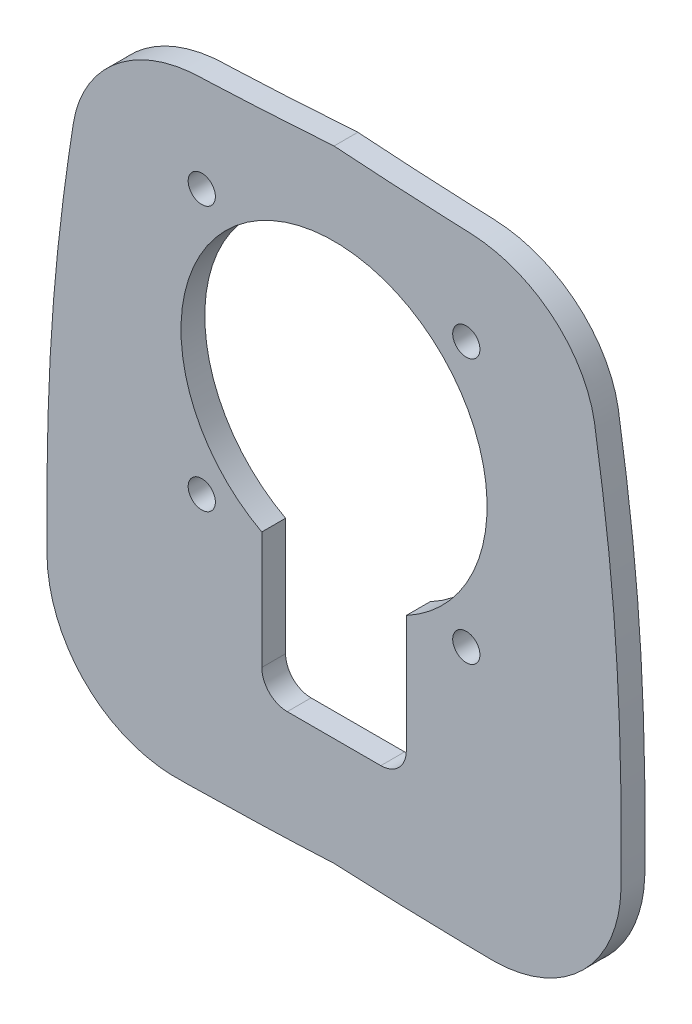
ISO-10303-21;
HEADER;
FILE_DESCRIPTION(('STEP AP214'),'2;1');
FILE_NAME('part.step','',(''),(''),'','','');
FILE_SCHEMA(('AUTOMOTIVE_DESIGN { 1 0 10303 214 1 1 1 1 }'));
ENDSEC;
DATA;
#1=APPLICATION_CONTEXT('core data for automotive mechanical design processes');
#2=APPLICATION_PROTOCOL_DEFINITION('international standard','automotive_design',2000,#1);
#3=PRODUCT_CONTEXT('',#1,'mechanical');
#4=PRODUCT('Part','Part','',(#3));
#5=PRODUCT_RELATED_PRODUCT_CATEGORY('part','',(#4));
#6=PRODUCT_DEFINITION_FORMATION('','',#4);
#7=PRODUCT_DEFINITION_CONTEXT('part definition',#1,'design');
#8=PRODUCT_DEFINITION('design','',#6,#7);
#9=PRODUCT_DEFINITION_SHAPE('','',#8);
#10=(LENGTH_UNIT() NAMED_UNIT(*) SI_UNIT(.MILLI.,.METRE.));
#11=(NAMED_UNIT(*) PLANE_ANGLE_UNIT() SI_UNIT($,.RADIAN.));
#12=(NAMED_UNIT(*) SI_UNIT($,.STERADIAN.) SOLID_ANGLE_UNIT());
#13=UNCERTAINTY_MEASURE_WITH_UNIT(LENGTH_MEASURE(1.E-05),#10,'distance_accuracy_value','');
#14=(GEOMETRIC_REPRESENTATION_CONTEXT(3) GLOBAL_UNCERTAINTY_ASSIGNED_CONTEXT((#13)) GLOBAL_UNIT_ASSIGNED_CONTEXT((#10,
#11,#12)) REPRESENTATION_CONTEXT('',''));
#15=CARTESIAN_POINT('',(0.,0.,0.));
#16=DIRECTION('',(0.,0.,1.));
#17=DIRECTION('',(1.,0.,0.));
#18=AXIS2_PLACEMENT_3D('',#15,#16,#17);
#19=CARTESIAN_POINT('',(-1.45177956925027E-05,131.329874447437,1.4));
#20=CARTESIAN_POINT('',(-1.26757890018893,131.24206360992,1.4));
#21=CARTESIAN_POINT('',(-3.80323463217484,131.071000312525,1.4));
#22=CARTESIAN_POINT('',(-7.6078416066327,130.850178677438,1.4));
#23=CARTESIAN_POINT('',(-10.7803483029258,130.686157300907,1.4));
#24=CARTESIAN_POINT('',(-13.3179264974607,130.573183430331,1.4));
#25=CARTESIAN_POINT('',(-14.9043894465949,130.50167168328,1.4));
#26=CARTESIAN_POINT('',(-16.1757283770955,130.463940264114,1.4));
#27=CARTESIAN_POINT('',(-17.5222612760719,130.359007823464,1.4));
#28=CARTESIAN_POINT('',(-19.8224314835212,129.963798754512,1.4));
#29=CARTESIAN_POINT('',(-22.9950329985623,128.808805249809,1.4));
#30=CARTESIAN_POINT('',(-26.3477581329389,126.496619676814,1.4));
#31=CARTESIAN_POINT('',(-28.5389968385978,123.882075598726,1.4));
#32=CARTESIAN_POINT('',(-29.7919830564272,121.475659209304,1.4));
#33=CARTESIAN_POINT('',(-30.3438963525391,119.877882558575,1.4));
#34=CARTESIAN_POINT('',(-30.6340344196886,118.533439446714,1.4));
#35=CARTESIAN_POINT('',(-30.8186457706988,117.266173597771,1.4));
#36=CARTESIAN_POINT('',(-31.0655064666946,115.69338325603,1.4));
#37=CARTESIAN_POINT('',(-31.3403609625635,113.798909793111,1.4));
#38=CARTESIAN_POINT('',(-31.6940154985475,111.271367457155,1.4));
#39=CARTESIAN_POINT('',(-32.263022369012,106.839432508403,1.4));
#40=CARTESIAN_POINT('',(-32.9231484726691,100.487419109632,1.4));
#41=CARTESIAN_POINT('',(-33.4439139417224,92.8411533747227,1.4));
#42=CARTESIAN_POINT('',(-33.6731028347638,86.4628994395996,1.4));
#43=CARTESIAN_POINT('',(-33.7606510875165,81.3616702774299,1.4));
#44=CARTESIAN_POINT('',(-33.7784377729807,78.1722626208568,1.4));
#45=CARTESIAN_POINT('',(-33.7769109645424,75.6249669050285,1.4));
#46=CARTESIAN_POINT('',(-33.7621109751898,74.0250252864479,1.4));
#47=CARTESIAN_POINT('',(-33.7594416186916,72.7621030177316,1.4));
#48=CARTESIAN_POINT('',(-33.7047522743412,71.4078635177268,1.4));
#49=CARTESIAN_POINT('',(-33.3762714122728,69.0902215963625,1.4));
#50=CARTESIAN_POINT('',(-32.2746698190239,65.8830990615317,1.4));
#51=CARTESIAN_POINT('',(-29.9807977781895,62.5160636306374,1.4));
#52=CARTESIAN_POINT('',(-26.8627387823259,59.8883547173038,1.4));
#53=CARTESIAN_POINT('',(-23.7749190988652,58.4811346722845,1.4));
#54=CARTESIAN_POINT('',(-21.15116229074,57.8723991104209,1.4));
#55=CARTESIAN_POINT('',(-19.4840989364515,57.7044874550725,1.4));
#56=CARTESIAN_POINT('',(-18.1426371712731,57.7018883035575,1.4));
#57=CARTESIAN_POINT('',(-16.8843539611285,57.7252869481008,1.4));
#58=CARTESIAN_POINT('',(-14.6422600593573,57.7632391227121,1.4));
#59=CARTESIAN_POINT('',(-11.4667236075039,57.8366094148448,1.4));
#60=CARTESIAN_POINT('',(-6.36731593826922,57.978415878453,1.4));
#61=CARTESIAN_POINT('',(-2.5466270780011,58.1349564793536,1.4));
#62=CARTESIAN_POINT('',(-0.00024253410771742,58.2631490037253,1.4));
#63=B_SPLINE_CURVE_WITH_KNOTS('',3,(#19,#20,#21,#22,#23,#24,#25,#26,#27,#28,#29,#30,#31,#32,#33,
#34,#35,#36,#37,#38,#39,#40,#41,#42,#43,#44,#45,#46,#47,#48,#49,#50,#51,#52,#53,#54,#55,#56,#57,
#58,#59,#60,#61,#62),.UNSPECIFIED.,.F.,.F.,(4,1,1,1,1,1,1,1,1,1,1,1,1,1,1,1,1,1,1,1,1,1,1,1,1,1,
1,1,1,1,1,1,1,1,1,1,1,1,1,1,1,4),(-0.000453624656461955,0.0308001846368697,0.0620539939302014,
0.0933078032235331,0.108934707870199,0.124561612516865,0.132375064840198,0.140188517163531,
0.155815421810196,0.187069231103528,0.21832304039686,0.249576849690191,0.265203754336857,
0.280830658983523,0.288644111306856,0.296457563630189,0.312084468276855,0.327711372923521,
0.343338277570187,0.374592086863518,0.437099705450182,0.499607324036845,0.562114942623508,
0.59336875191684,0.624622561210172,0.640249465856838,0.655876370503503,0.663689822826836,
0.671503275150169,0.687130179796835,0.718383989090167,0.749637798383498,0.78089160767683,
0.812145416970162,0.827772321616827,0.843399226263493,0.851212678586826,0.859026130910159,
0.874653035556825,0.905906844850157,0.937160654143488,0.999668272730152),.UNSPECIFIED.);
#64=DIRECTION('',(0.,0.,-1.));
#65=VECTOR('',#64,1.);
#66=SURFACE_OF_LINEAR_EXTRUSION('',#63,#65);
#67=CARTESIAN_POINT('',(-1.45177956925027E-05,131.329874447437,-1.4));
#68=CARTESIAN_POINT('',(-1.26757890018893,131.24206360992,-1.4));
#69=CARTESIAN_POINT('',(-3.80323463217484,131.071000312525,-1.4));
#70=CARTESIAN_POINT('',(-7.6078416066327,130.850178677438,-1.4));
#71=CARTESIAN_POINT('',(-10.7803483029258,130.686157300907,-1.4));
#72=CARTESIAN_POINT('',(-13.3179264974607,130.573183430331,-1.4));
#73=CARTESIAN_POINT('',(-14.9043894465949,130.50167168328,-1.4));
#74=CARTESIAN_POINT('',(-16.1757283770955,130.463940264114,-1.4));
#75=CARTESIAN_POINT('',(-17.5222612760719,130.359007823464,-1.4));
#76=CARTESIAN_POINT('',(-19.8224314835212,129.963798754512,-1.4));
#77=CARTESIAN_POINT('',(-22.9950329985623,128.808805249809,-1.4));
#78=CARTESIAN_POINT('',(-26.3477581329389,126.496619676814,-1.4));
#79=CARTESIAN_POINT('',(-28.5389968385978,123.882075598726,-1.4));
#80=CARTESIAN_POINT('',(-29.7919830564272,121.475659209304,-1.4));
#81=CARTESIAN_POINT('',(-30.3438963525391,119.877882558575,-1.4));
#82=CARTESIAN_POINT('',(-30.6340344196886,118.533439446714,-1.4));
#83=CARTESIAN_POINT('',(-30.8186457706988,117.266173597771,-1.4));
#84=CARTESIAN_POINT('',(-31.0655064666946,115.69338325603,-1.4));
#85=CARTESIAN_POINT('',(-31.3403609625635,113.798909793111,-1.4));
#86=CARTESIAN_POINT('',(-31.6940154985475,111.271367457155,-1.4));
#87=CARTESIAN_POINT('',(-32.263022369012,106.839432508403,-1.4));
#88=CARTESIAN_POINT('',(-32.9231484726691,100.487419109632,-1.4));
#89=CARTESIAN_POINT('',(-33.4439139417224,92.8411533747227,-1.4));
#90=CARTESIAN_POINT('',(-33.6731028347638,86.4628994395996,-1.4));
#91=CARTESIAN_POINT('',(-33.7606510875165,81.3616702774299,-1.4));
#92=CARTESIAN_POINT('',(-33.7784377729807,78.1722626208568,-1.4));
#93=CARTESIAN_POINT('',(-33.7769109645424,75.6249669050285,-1.4));
#94=CARTESIAN_POINT('',(-33.7621109751898,74.0250252864479,-1.4));
#95=CARTESIAN_POINT('',(-33.7594416186916,72.7621030177316,-1.4));
#96=CARTESIAN_POINT('',(-33.7047522743412,71.4078635177268,-1.4));
#97=CARTESIAN_POINT('',(-33.3762714122728,69.0902215963625,-1.4));
#98=CARTESIAN_POINT('',(-32.2746698190239,65.8830990615317,-1.4));
#99=CARTESIAN_POINT('',(-29.9807977781895,62.5160636306374,-1.4));
#100=CARTESIAN_POINT('',(-26.8627387823259,59.8883547173038,-1.4));
#101=CARTESIAN_POINT('',(-23.7749190988652,58.4811346722845,-1.4));
#102=CARTESIAN_POINT('',(-21.15116229074,57.8723991104209,-1.4));
#103=CARTESIAN_POINT('',(-19.4840989364515,57.7044874550725,-1.4));
#104=CARTESIAN_POINT('',(-18.1426371712731,57.7018883035575,-1.4));
#105=CARTESIAN_POINT('',(-16.8843539611285,57.7252869481008,-1.4));
#106=CARTESIAN_POINT('',(-14.6422600593573,57.7632391227121,-1.4));
#107=CARTESIAN_POINT('',(-11.4667236075039,57.8366094148448,-1.4));
#108=CARTESIAN_POINT('',(-6.36731593826922,57.978415878453,-1.4));
#109=CARTESIAN_POINT('',(-2.5466270780011,58.1349564793536,-1.4));
#110=CARTESIAN_POINT('',(-0.00024253410771742,58.2631490037253,-1.4));
#111=B_SPLINE_CURVE_WITH_KNOTS('',3,(#67,#68,#69,#70,#71,#72,#73,#74,#75,#76,#77,#78,#79,#80,
#81,#82,#83,#84,#85,#86,#87,#88,#89,#90,#91,#92,#93,#94,#95,#96,#97,#98,#99,#100,#101,#102,#103,
#104,#105,#106,#107,#108,#109,#110),.UNSPECIFIED.,.F.,.F.,(4,1,1,1,1,1,1,1,1,1,1,1,1,1,1,1,1,1,
1,1,1,1,1,1,1,1,1,1,1,1,1,1,1,1,1,1,1,1,1,1,1,4),(-0.000453624656461955,0.0308001846368697,
0.0620539939302014,0.0933078032235331,0.108934707870199,0.124561612516865,0.132375064840198,
0.140188517163531,0.155815421810196,0.187069231103528,0.21832304039686,0.249576849690191,
0.265203754336857,0.280830658983523,0.288644111306856,0.296457563630189,0.312084468276855,
0.327711372923521,0.343338277570187,0.374592086863518,0.437099705450182,0.499607324036845,
0.562114942623508,0.59336875191684,0.624622561210172,0.640249465856838,0.655876370503503,
0.663689822826836,0.671503275150169,0.687130179796835,0.718383989090167,0.749637798383498,
0.78089160767683,0.812145416970162,0.827772321616827,0.843399226263493,0.851212678586826,
0.859026130910159,0.874653035556825,0.905906844850157,0.937160654143488,0.999668272730152),.UNSPECIFIED.);
#112=CARTESIAN_POINT('',(-1.45177956925027E-05,131.329874447437,-1.4));
#113=VERTEX_POINT('',#112);
#114=CARTESIAN_POINT('',(-0.00024253410771742,58.2631490037253,-1.4));
#115=VERTEX_POINT('',#114);
#116=EDGE_CURVE('E221',#113,#115,#111,.T.);
#117=ORIENTED_EDGE('',*,*,#116,.T.);
#118=DIRECTION('',(0.,0.,-1.));
#119=VECTOR('',#118,1.);
#120=CARTESIAN_POINT('',(-0.00024253410771742,58.2631490037253,1.4));
#121=LINE('',#120,#119);
#122=CARTESIAN_POINT('',(-0.00024253410771742,58.2631490037253,1.4));
#123=VERTEX_POINT('',#122);
#124=EDGE_CURVE('E11',#123,#115,#121,.T.);
#125=ORIENTED_EDGE('',*,*,#124,.F.);
#126=CARTESIAN_POINT('',(-1.45177956925027E-05,131.329874447437,1.4));
#127=VERTEX_POINT('',#126);
#128=EDGE_CURVE('E130',#127,#123,#63,.T.);
#129=ORIENTED_EDGE('',*,*,#128,.F.);
#130=DIRECTION('',(0.,0.,-1.));
#131=VECTOR('',#130,1.);
#132=CARTESIAN_POINT('',(-1.45177956925027E-05,131.329874447437,1.4));
#133=LINE('',#132,#131);
#134=EDGE_CURVE('E47',#127,#113,#133,.T.);
#135=ORIENTED_EDGE('',*,*,#134,.T.);
#136=EDGE_LOOP('',(#117,#125,#129,#135));
#137=FACE_BOUND('',#136,.T.);
#138=ADVANCED_FACE('F37',(#137),#66,.F.);
#139=CARTESIAN_POINT('',(5.5,73.9713049063582,1.4));
#140=DIRECTION('',(0.,0.,-1.));
#141=DIRECTION('',(-1.,0.,0.));
#142=AXIS2_PLACEMENT_3D('',#139,#140,#141);
#143=CYLINDRICAL_SURFACE('',#142,3.00000000000001);
#144=CARTESIAN_POINT('',(5.5,73.9713049063582,-1.4));
#145=DIRECTION('',(0.,0.,1.));
#146=DIRECTION('',(1.,0.,0.));
#147=AXIS2_PLACEMENT_3D('',#144,#145,#146);
#148=CIRCLE('',#147,3.00000000000001);
#149=CARTESIAN_POINT('',(5.5,70.9713049063582,-1.4));
#150=VERTEX_POINT('',#149);
#151=CARTESIAN_POINT('',(8.5,73.9713049063582,-1.4));
#152=VERTEX_POINT('',#151);
#153=EDGE_CURVE('E206',#150,#152,#148,.T.);
#154=ORIENTED_EDGE('',*,*,#153,.F.);
#155=DIRECTION('',(0.,0.,-1.));
#156=VECTOR('',#155,1.);
#157=CARTESIAN_POINT('',(5.5,70.9713049063582,1.4));
#158=LINE('',#157,#156);
#159=CARTESIAN_POINT('',(5.5,70.9713049063582,1.4));
#160=VERTEX_POINT('',#159);
#161=EDGE_CURVE('E41',#160,#150,#158,.T.);
#162=ORIENTED_EDGE('',*,*,#161,.F.);
#163=CARTESIAN_POINT('',(5.5,73.9713049063582,1.4));
#164=DIRECTION('',(0.,0.,1.));
#165=DIRECTION('',(1.,0.,0.));
#166=AXIS2_PLACEMENT_3D('',#163,#164,#165);
#167=CIRCLE('',#166,3.00000000000001);
#168=CARTESIAN_POINT('',(8.5,73.9713049063582,1.4));
#169=VERTEX_POINT('',#168);
#170=EDGE_CURVE('E119',#160,#169,#167,.T.);
#171=ORIENTED_EDGE('',*,*,#170,.T.);
#172=DIRECTION('',(0.,0.,-1.));
#173=VECTOR('',#172,1.);
#174=CARTESIAN_POINT('',(8.5,73.9713049063582,1.4));
#175=LINE('',#174,#173);
#176=EDGE_CURVE('E109',#169,#152,#175,.T.);
#177=ORIENTED_EDGE('',*,*,#176,.T.);
#178=EDGE_LOOP('',(#154,#162,#171,#177));
#179=FACE_BOUND('',#178,.T.);
#180=ADVANCED_FACE('F120',(#179),#143,.F.);
#181=CARTESIAN_POINT('',(0.,70.9713049063582,1.4));
#182=DIRECTION('',(0.,-1.,0.));
#183=DIRECTION('',(0.,0.,-1.));
#184=AXIS2_PLACEMENT_3D('',#181,#182,#183);
#185=PLANE('',#184);
#186=DIRECTION('',(-1.,0.,0.));
#187=VECTOR('',#186,1.);
#188=CARTESIAN_POINT('',(0.,70.9713049063582,-1.4));
#189=LINE('',#188,#187);
#190=CARTESIAN_POINT('',(-5.5,70.9713049063582,-1.4));
#191=VERTEX_POINT('',#190);
#192=EDGE_CURVE('E208',#150,#191,#189,.T.);
#193=ORIENTED_EDGE('',*,*,#192,.T.);
#194=DIRECTION('',(0.,0.,-1.));
#195=VECTOR('',#194,1.);
#196=CARTESIAN_POINT('',(-5.5,70.9713049063582,1.4));
#197=LINE('',#196,#195);
#198=CARTESIAN_POINT('',(-5.5,70.9713049063582,1.4));
#199=VERTEX_POINT('',#198);
#200=EDGE_CURVE('E242',#199,#191,#197,.T.);
#201=ORIENTED_EDGE('',*,*,#200,.F.);
#202=DIRECTION('',(-1.,0.,0.));
#203=VECTOR('',#202,1.);
#204=CARTESIAN_POINT('',(0.,70.9713049063582,1.4));
#205=LINE('',#204,#203);
#206=EDGE_CURVE('E123',#160,#199,#205,.T.);
#207=ORIENTED_EDGE('',*,*,#206,.F.);
#208=ORIENTED_EDGE('',*,*,#161,.T.);
#209=EDGE_LOOP('',(#193,#201,#207,#208));
#210=FACE_BOUND('',#209,.T.);
#211=ADVANCED_FACE('F168',(#210),#185,.F.);
#212=CARTESIAN_POINT('',(-5.5,73.9713049063582,1.4));
#213=DIRECTION('',(0.,0.,-1.));
#214=DIRECTION('',(-1.,0.,0.));
#215=AXIS2_PLACEMENT_3D('',#212,#213,#214);
#216=CYLINDRICAL_SURFACE('',#215,3.00000000000001);
#217=CARTESIAN_POINT('',(-5.5,73.9713049063582,-1.4));
#218=DIRECTION('',(0.,0.,1.));
#219=DIRECTION('',(1.,0.,0.));
#220=AXIS2_PLACEMENT_3D('',#217,#218,#219);
#221=CIRCLE('',#220,3.00000000000001);
#222=CARTESIAN_POINT('',(-8.5,73.9713049063582,-1.4));
#223=VERTEX_POINT('',#222);
#224=EDGE_CURVE('E211',#191,#223,#221,.F.);
#225=ORIENTED_EDGE('',*,*,#224,.T.);
#226=DIRECTION('',(0.,0.,-1.));
#227=VECTOR('',#226,1.);
#228=CARTESIAN_POINT('',(-8.5,73.9713049063582,1.4));
#229=LINE('',#228,#227);
#230=CARTESIAN_POINT('',(-8.5,73.9713049063582,1.4));
#231=VERTEX_POINT('',#230);
#232=EDGE_CURVE('E240',#231,#223,#229,.T.);
#233=ORIENTED_EDGE('',*,*,#232,.F.);
#234=CARTESIAN_POINT('',(-5.5,73.9713049063582,1.4));
#235=DIRECTION('',(0.,0.,1.));
#236=DIRECTION('',(1.,0.,0.));
#237=AXIS2_PLACEMENT_3D('',#234,#235,#236);
#238=CIRCLE('',#237,3.00000000000001);
#239=EDGE_CURVE('E250',#199,#231,#238,.F.);
#240=ORIENTED_EDGE('',*,*,#239,.F.);
#241=ORIENTED_EDGE('',*,*,#200,.T.);
#242=EDGE_LOOP('',(#225,#233,#240,#241));
#243=FACE_BOUND('',#242,.T.);
#244=ADVANCED_FACE('F164',(#243),#216,.F.);
#245=CARTESIAN_POINT('',(-8.5,0.,1.4));
#246=DIRECTION('',(-1.,0.,0.));
#247=DIRECTION('',(0.,0.,1.));
#248=AXIS2_PLACEMENT_3D('',#245,#246,#247);
#249=PLANE('',#248);
#250=DIRECTION('',(0.,1.,0.));
#251=VECTOR('',#250,1.);
#252=CARTESIAN_POINT('',(-8.5,0.,-1.4));
#253=LINE('',#252,#251);
#254=CARTESIAN_POINT('',(-8.5,87.7703133679981,-1.4));
#255=VERTEX_POINT('',#254);
#256=EDGE_CURVE('E214',#223,#255,#253,.T.);
#257=ORIENTED_EDGE('',*,*,#256,.T.);
#258=DIRECTION('',(0.,0.,-1.));
#259=VECTOR('',#258,1.);
#260=CARTESIAN_POINT('',(-8.5,87.7703133679981,1.4));
#261=LINE('',#260,#259);
#262=CARTESIAN_POINT('',(-8.5,87.7703133679981,1.4));
#263=VERTEX_POINT('',#262);
#264=EDGE_CURVE('E238',#263,#255,#261,.T.);
#265=ORIENTED_EDGE('',*,*,#264,.F.);
#266=DIRECTION('',(0.,1.,0.));
#267=VECTOR('',#266,1.);
#268=CARTESIAN_POINT('',(-8.5,0.,1.4));
#269=LINE('',#268,#267);
#270=EDGE_CURVE('E133',#231,#263,#269,.T.);
#271=ORIENTED_EDGE('',*,*,#270,.F.);
#272=ORIENTED_EDGE('',*,*,#232,.T.);
#273=EDGE_LOOP('',(#257,#265,#271,#272));
#274=FACE_BOUND('',#273,.T.);
#275=ADVANCED_FACE('F160',(#274),#249,.F.);
#276=CARTESIAN_POINT('',(0.,103.636945020621,1.4));
#277=DIRECTION('',(0.,0.,-1.));
#278=DIRECTION('',(-1.,0.,0.));
#279=AXIS2_PLACEMENT_3D('',#276,#277,#278);
#280=CYLINDRICAL_SURFACE('',#279,18.);
#281=CARTESIAN_POINT('',(0.,103.636945020621,-1.4));
#282=DIRECTION('',(0.,0.,1.));
#283=DIRECTION('',(1.,0.,0.));
#284=AXIS2_PLACEMENT_3D('',#281,#282,#283);
#285=CIRCLE('',#284,18.);
#286=CARTESIAN_POINT('',(8.5,87.7703133679981,-1.4));
#287=VERTEX_POINT('',#286);
#288=EDGE_CURVE('E217',#287,#255,#285,.T.);
#289=ORIENTED_EDGE('',*,*,#288,.F.);
#290=DIRECTION('',(0.,0.,-1.));
#291=VECTOR('',#290,1.);
#292=CARTESIAN_POINT('',(8.5,87.7703133679981,1.4));
#293=LINE('',#292,#291);
#294=CARTESIAN_POINT('',(8.5,87.7703133679981,1.4));
#295=VERTEX_POINT('',#294);
#296=EDGE_CURVE('E116',#295,#287,#293,.T.);
#297=ORIENTED_EDGE('',*,*,#296,.F.);
#298=CARTESIAN_POINT('',(0.,103.636945020621,1.4));
#299=DIRECTION('',(0.,0.,1.));
#300=DIRECTION('',(1.,0.,0.));
#301=AXIS2_PLACEMENT_3D('',#298,#299,#300);
#302=CIRCLE('',#301,18.);
#303=EDGE_CURVE('E129',#295,#263,#302,.T.);
#304=ORIENTED_EDGE('',*,*,#303,.T.);
#305=ORIENTED_EDGE('',*,*,#264,.T.);
#306=EDGE_LOOP('',(#289,#297,#304,#305));
#307=FACE_BOUND('',#306,.T.);
#308=ADVANCED_FACE('F157',(#307),#280,.F.);
#309=CARTESIAN_POINT('',(8.5,0.,1.4));
#310=DIRECTION('',(-1.,0.,0.));
#311=DIRECTION('',(0.,0.,1.));
#312=AXIS2_PLACEMENT_3D('',#309,#310,#311);
#313=PLANE('',#312);
#314=DIRECTION('',(0.,1.,0.));
#315=VECTOR('',#314,1.);
#316=CARTESIAN_POINT('',(8.5,0.,-1.4));
#317=LINE('',#316,#315);
#318=EDGE_CURVE('E114',#152,#287,#317,.T.);
#319=ORIENTED_EDGE('',*,*,#318,.F.);
#320=ORIENTED_EDGE('',*,*,#176,.F.);
#321=DIRECTION('',(0.,1.,0.));
#322=VECTOR('',#321,1.);
#323=CARTESIAN_POINT('',(8.5,0.,1.4));
#324=LINE('',#323,#322);
#325=EDGE_CURVE('E112',#169,#295,#324,.T.);
#326=ORIENTED_EDGE('',*,*,#325,.T.);
#327=ORIENTED_EDGE('',*,*,#296,.T.);
#328=EDGE_LOOP('',(#319,#320,#326,#327));
#329=FACE_BOUND('',#328,.T.);
#330=ADVANCED_FACE('F110',(#329),#313,.T.);
#331=CARTESIAN_POINT('',(-15.5566054899205,88.0799453819508,1.4));
#332=DIRECTION('',(0.,0.,-1.));
#333=DIRECTION('',(-1.,0.,0.));
#334=AXIS2_PLACEMENT_3D('',#331,#332,#333);
#335=CYLINDRICAL_SURFACE('',#334,1.60000000000001);
#336=CARTESIAN_POINT('',(-15.5566054899205,88.0799453819508,1.4));
#337=DIRECTION('',(0.,0.,1.));
#338=DIRECTION('',(1.,0.,0.));
#339=AXIS2_PLACEMENT_3D('',#336,#337,#338);
#340=CIRCLE('',#339,1.60000000000001);
#341=CARTESIAN_POINT('',(-13.9566054899205,88.0799453819508,1.4));
#342=VERTEX_POINT('',#341);
#343=EDGE_CURVE('E124',#342,#342,#340,.T.);
#344=ORIENTED_EDGE('',*,*,#343,.T.);
#345=EDGE_LOOP('',(#344));
#346=FACE_BOUND('',#345,.T.);
#347=CARTESIAN_POINT('',(-15.5566054899205,88.0799453819508,-1.4));
#348=DIRECTION('',(0.,0.,1.));
#349=DIRECTION('',(1.,0.,0.));
#350=AXIS2_PLACEMENT_3D('',#347,#348,#349);
#351=CIRCLE('',#350,1.60000000000001);
#352=CARTESIAN_POINT('',(-13.9566054899205,88.0799453819508,-1.4));
#353=VERTEX_POINT('',#352);
#354=EDGE_CURVE('E200',#353,#353,#351,.T.);
#355=ORIENTED_EDGE('',*,*,#354,.F.);
#356=EDGE_LOOP('',(#355));
#357=FACE_BOUND('',#356,.T.);
#358=ADVANCED_FACE('F156',(#346,#357),#335,.F.);
#359=CARTESIAN_POINT('',(-15.5566054899205,119.19394465929,1.4));
#360=DIRECTION('',(0.,0.,-1.));
#361=DIRECTION('',(-1.,0.,0.));
#362=AXIS2_PLACEMENT_3D('',#359,#360,#361);
#363=CYLINDRICAL_SURFACE('',#362,1.60000000000001);
#364=CARTESIAN_POINT('',(-15.5566054899205,119.19394465929,1.4));
#365=DIRECTION('',(0.,0.,1.));
#366=DIRECTION('',(1.,0.,0.));
#367=AXIS2_PLACEMENT_3D('',#364,#365,#366);
#368=CIRCLE('',#367,1.60000000000001);
#369=CARTESIAN_POINT('',(-13.9566054899205,119.19394465929,1.4));
#370=VERTEX_POINT('',#369);
#371=EDGE_CURVE('E257',#370,#370,#368,.F.);
#372=ORIENTED_EDGE('',*,*,#371,.F.);
#373=EDGE_LOOP('',(#372));
#374=FACE_BOUND('',#373,.T.);
#375=CARTESIAN_POINT('',(-15.5566054899205,119.19394465929,-1.4));
#376=DIRECTION('',(0.,0.,1.));
#377=DIRECTION('',(1.,0.,0.));
#378=AXIS2_PLACEMENT_3D('',#375,#376,#377);
#379=CIRCLE('',#378,1.60000000000001);
#380=CARTESIAN_POINT('',(-13.9566054899205,119.19394465929,-1.4));
#381=VERTEX_POINT('',#380);
#382=EDGE_CURVE('E196',#381,#381,#379,.F.);
#383=ORIENTED_EDGE('',*,*,#382,.T.);
#384=EDGE_LOOP('',(#383));
#385=FACE_BOUND('',#384,.T.);
#386=ADVANCED_FACE('F177',(#374,#385),#363,.F.);
#387=CARTESIAN_POINT('',(15.556349186104,119.193294206725,1.4));
#388=DIRECTION('',(0.,0.,-1.));
#389=DIRECTION('',(-1.,0.,0.));
#390=AXIS2_PLACEMENT_3D('',#387,#388,#389);
#391=CYLINDRICAL_SURFACE('',#390,1.6);
#392=CARTESIAN_POINT('',(15.556349186104,119.193294206725,1.4));
#393=DIRECTION('',(0.,0.,1.));
#394=DIRECTION('',(1.,0.,0.));
#395=AXIS2_PLACEMENT_3D('',#392,#393,#394);
#396=CIRCLE('',#395,1.6);
#397=CARTESIAN_POINT('',(17.1563491861041,119.193294206725,1.4));
#398=VERTEX_POINT('',#397);
#399=EDGE_CURVE('E191',#398,#398,#396,.T.);
#400=ORIENTED_EDGE('',*,*,#399,.T.);
#401=EDGE_LOOP('',(#400));
#402=FACE_BOUND('',#401,.T.);
#403=CARTESIAN_POINT('',(15.556349186104,119.193294206725,-1.4));
#404=DIRECTION('',(0.,0.,1.));
#405=DIRECTION('',(1.,0.,0.));
#406=AXIS2_PLACEMENT_3D('',#403,#404,#405);
#407=CIRCLE('',#406,1.6);
#408=CARTESIAN_POINT('',(17.1563491861041,119.193294206725,-1.4));
#409=VERTEX_POINT('',#408);
#410=EDGE_CURVE('E194',#409,#409,#407,.T.);
#411=ORIENTED_EDGE('',*,*,#410,.F.);
#412=EDGE_LOOP('',(#411));
#413=FACE_BOUND('',#412,.T.);
#414=ADVANCED_FACE('F180',(#402,#413),#391,.F.);
#415=CARTESIAN_POINT('',(15.556349186104,88.0805958345165,1.4));
#416=DIRECTION('',(0.,0.,-1.));
#417=DIRECTION('',(-1.,0.,0.));
#418=AXIS2_PLACEMENT_3D('',#415,#416,#417);
#419=CYLINDRICAL_SURFACE('',#418,1.6);
#420=CARTESIAN_POINT('',(15.556349186104,88.0805958345165,1.4));
#421=DIRECTION('',(0.,0.,1.));
#422=DIRECTION('',(1.,0.,0.));
#423=AXIS2_PLACEMENT_3D('',#420,#421,#422);
#424=CIRCLE('',#423,1.6);
#425=CARTESIAN_POINT('',(17.1563491861041,88.0805958345165,1.4));
#426=VERTEX_POINT('',#425);
#427=EDGE_CURVE('E232',#426,#426,#424,.F.);
#428=ORIENTED_EDGE('',*,*,#427,.F.);
#429=EDGE_LOOP('',(#428));
#430=FACE_BOUND('',#429,.T.);
#431=CARTESIAN_POINT('',(15.556349186104,88.0805958345165,-1.4));
#432=DIRECTION('',(0.,0.,1.));
#433=DIRECTION('',(1.,0.,0.));
#434=AXIS2_PLACEMENT_3D('',#431,#432,#433);
#435=CIRCLE('',#434,1.6);
#436=CARTESIAN_POINT('',(17.1563491861041,88.0805958345165,-1.4));
#437=VERTEX_POINT('',#436);
#438=EDGE_CURVE('E197',#437,#437,#435,.F.);
#439=ORIENTED_EDGE('',*,*,#438,.T.);
#440=EDGE_LOOP('',(#439));
#441=FACE_BOUND('',#440,.T.);
#442=ADVANCED_FACE('F39',(#430,#441),#419,.F.);
#443=CARTESIAN_POINT('',(-0.000242534107722699,58.2631490037253,1.4));
#444=CARTESIAN_POINT('',(2.54641044550369,58.1333983476497,1.4));
#445=CARTESIAN_POINT('',(6.36794907466032,57.9786404717773,1.4));
#446=CARTESIAN_POINT('',(11.4674078503116,57.8366980753222,1.4));
#447=CARTESIAN_POINT('',(14.6439875787945,57.762539624274,1.4));
#448=CARTESIAN_POINT('',(16.8851073263748,57.7263669838294,1.4));
#449=CARTESIAN_POINT('',(18.1451853329415,57.70103257929,1.4));
#450=CARTESIAN_POINT('',(19.4846300201946,57.7051532554583,1.4));
#451=CARTESIAN_POINT('',(21.1531933143095,57.8725777863686,1.4));
#452=CARTESIAN_POINT('',(23.7771205638609,58.4819455784255,1.4));
#453=CARTESIAN_POINT('',(26.8696682565746,59.8926727463384,1.4));
#454=CARTESIAN_POINT('',(29.9867117558448,62.5219398786558,1.4));
#455=CARTESIAN_POINT('',(32.2780992023673,65.8924750876757,1.4));
#456=CARTESIAN_POINT('',(33.3770324200565,69.0874185595095,1.4));
#457=CARTESIAN_POINT('',(33.7542792422868,71.7646718366431,1.4));
#458=CARTESIAN_POINT('',(33.7615768646557,73.7307519178224,1.4));
#459=CARTESIAN_POINT('',(33.7762634269781,75.6278663088774,1.4));
#460=CARTESIAN_POINT('',(33.7787896252248,78.1829920879589,1.4));
#461=CARTESIAN_POINT('',(33.7604340507275,81.3689228611293,1.4));
#462=CARTESIAN_POINT('',(33.6729447473774,86.4720693648178,1.4));
#463=CARTESIAN_POINT('',(33.4434193664569,92.8500560958871,1.4));
#464=CARTESIAN_POINT('',(32.9223315386914,100.49719306257,1.4));
#465=CARTESIAN_POINT('',(32.2619247346914,106.849604955989,1.4));
#466=CARTESIAN_POINT('',(31.6924884774455,111.281956752059,1.4));
#467=CARTESIAN_POINT('',(31.3390003931817,113.809474839524,1.4));
#468=CARTESIAN_POINT('',(31.0637417134624,115.704697771842,1.4));
#469=CARTESIAN_POINT('',(30.8175764562076,117.27614370351,1.4));
#470=CARTESIAN_POINT('',(30.6316519773454,118.547352174808,1.4));
#471=CARTESIAN_POINT('',(30.3407568244041,119.888301445101,1.4));
#472=CARTESIAN_POINT('',(29.7877146984245,121.486256589049,1.4));
#473=CARTESIAN_POINT('',(28.5328062634621,123.890164463109,1.4));
#474=CARTESIAN_POINT('',(26.3429776606531,126.500218601478,1.4));
#475=CARTESIAN_POINT('',(22.9984203816975,128.806954431378,1.4));
#476=CARTESIAN_POINT('',(19.8233961739057,129.963221763359,1.4));
#477=CARTESIAN_POINT('',(17.5249446080649,130.359074285788,1.4));
#478=CARTESIAN_POINT('',(16.176301063401,130.463473016129,1.4));
#479=CARTESIAN_POINT('',(14.9043986593828,130.501585659765,1.4));
#480=CARTESIAN_POINT('',(13.3195088458964,130.573171615243,1.4));
#481=CARTESIAN_POINT('',(10.7808953488966,130.686119103644,1.4));
#482=CARTESIAN_POINT('',(7.60850830318077,130.850163366419,1.4));
#483=CARTESIAN_POINT('',(3.80355290363851,131.070932744317,1.4));
#484=CARTESIAN_POINT('',(1.26766937021344,131.242101451291,1.4));
#485=CARTESIAN_POINT('',(-1.45177958378468E-05,131.329874447437,1.4));
#486=B_SPLINE_CURVE_WITH_KNOTS('',3,(#443,#444,#445,#446,#447,#448,#449,#450,#451,#452,#453,
#454,#455,#456,#457,#458,#459,#460,#461,#462,#463,#464,#465,#466,#467,#468,#469,#470,#471,#472,
#473,#474,#475,#476,#477,#478,#479,#480,#481,#482,#483,#484,#485),.UNSPECIFIED.,.F.,.F.,(4,1,1,
1,1,1,1,1,1,1,1,1,1,1,1,1,1,1,1,1,1,1,1,1,1,1,1,1,1,1,1,1,1,1,1,1,1,1,1,1,4),
(0.000331696981759421,0.062839315152111,0.0940931242372867,0.125346933322463,0.14097383786505,
0.148787290136344,0.156600742407638,0.172227646950226,0.187854551492814,0.21910836057799,
0.250362169663166,0.281615978748341,0.312869787833517,0.328496692376105,0.344123596918693,
0.359750501461281,0.375377406003869,0.406631215089044,0.43788502417422,0.500392642344572,
0.562900260514923,0.625407878685275,0.656661687770451,0.672288592313038,0.687915496855626,
0.703542401398214,0.711355853669508,0.719169305940802,0.73479621048339,0.750423115025978,
0.781676924111154,0.812930733196329,0.844184542281505,0.859811446824093,0.867624899095387,
0.875438351366681,0.891065255909269,0.906692160451857,0.937945969537033,0.969199778622208,
1.00045358770738),.UNSPECIFIED.);
#487=DIRECTION('',(0.,0.,-1.));
#488=VECTOR('',#487,1.);
#489=SURFACE_OF_LINEAR_EXTRUSION('',#486,#488);
#490=CARTESIAN_POINT('',(-0.000242534107722699,58.2631490037253,-1.4));
#491=CARTESIAN_POINT('',(2.54641044550369,58.1333983476497,-1.4));
#492=CARTESIAN_POINT('',(6.36794907466032,57.9786404717773,-1.4));
#493=CARTESIAN_POINT('',(11.4674078503116,57.8366980753222,-1.4));
#494=CARTESIAN_POINT('',(14.6439875787945,57.762539624274,-1.4));
#495=CARTESIAN_POINT('',(16.8851073263748,57.7263669838294,-1.4));
#496=CARTESIAN_POINT('',(18.1451853329415,57.70103257929,-1.4));
#497=CARTESIAN_POINT('',(19.4846300201946,57.7051532554583,-1.4));
#498=CARTESIAN_POINT('',(21.1531933143095,57.8725777863686,-1.4));
#499=CARTESIAN_POINT('',(23.7771205638609,58.4819455784255,-1.4));
#500=CARTESIAN_POINT('',(26.8696682565746,59.8926727463384,-1.4));
#501=CARTESIAN_POINT('',(29.9867117558448,62.5219398786558,-1.4));
#502=CARTESIAN_POINT('',(32.2780992023673,65.8924750876757,-1.4));
#503=CARTESIAN_POINT('',(33.3770324200565,69.0874185595095,-1.4));
#504=CARTESIAN_POINT('',(33.7542792422868,71.7646718366431,-1.4));
#505=CARTESIAN_POINT('',(33.7615768646557,73.7307519178224,-1.4));
#506=CARTESIAN_POINT('',(33.7762634269781,75.6278663088774,-1.4));
#507=CARTESIAN_POINT('',(33.7787896252248,78.1829920879589,-1.4));
#508=CARTESIAN_POINT('',(33.7604340507275,81.3689228611293,-1.4));
#509=CARTESIAN_POINT('',(33.6729447473774,86.4720693648178,-1.4));
#510=CARTESIAN_POINT('',(33.4434193664569,92.8500560958871,-1.4));
#511=CARTESIAN_POINT('',(32.9223315386914,100.49719306257,-1.4));
#512=CARTESIAN_POINT('',(32.2619247346914,106.849604955989,-1.4));
#513=CARTESIAN_POINT('',(31.6924884774455,111.281956752059,-1.4));
#514=CARTESIAN_POINT('',(31.3390003931817,113.809474839524,-1.4));
#515=CARTESIAN_POINT('',(31.0637417134624,115.704697771842,-1.4));
#516=CARTESIAN_POINT('',(30.8175764562076,117.27614370351,-1.4));
#517=CARTESIAN_POINT('',(30.6316519773454,118.547352174808,-1.4));
#518=CARTESIAN_POINT('',(30.3407568244041,119.888301445101,-1.4));
#519=CARTESIAN_POINT('',(29.7877146984245,121.486256589049,-1.4));
#520=CARTESIAN_POINT('',(28.5328062634621,123.890164463109,-1.4));
#521=CARTESIAN_POINT('',(26.3429776606531,126.500218601478,-1.4));
#522=CARTESIAN_POINT('',(22.9984203816975,128.806954431378,-1.4));
#523=CARTESIAN_POINT('',(19.8233961739057,129.963221763359,-1.4));
#524=CARTESIAN_POINT('',(17.5249446080649,130.359074285788,-1.4));
#525=CARTESIAN_POINT('',(16.176301063401,130.463473016129,-1.4));
#526=CARTESIAN_POINT('',(14.9043986593828,130.501585659765,-1.4));
#527=CARTESIAN_POINT('',(13.3195088458964,130.573171615243,-1.4));
#528=CARTESIAN_POINT('',(10.7808953488966,130.686119103644,-1.4));
#529=CARTESIAN_POINT('',(7.60850830318077,130.850163366419,-1.4));
#530=CARTESIAN_POINT('',(3.80355290363851,131.070932744317,-1.4));
#531=CARTESIAN_POINT('',(1.26766937021344,131.242101451291,-1.4));
#532=CARTESIAN_POINT('',(-1.45177958378468E-05,131.329874447437,-1.4));
#533=B_SPLINE_CURVE_WITH_KNOTS('',3,(#490,#491,#492,#493,#494,#495,#496,#497,#498,#499,#500,
#501,#502,#503,#504,#505,#506,#507,#508,#509,#510,#511,#512,#513,#514,#515,#516,#517,#518,#519,
#520,#521,#522,#523,#524,#525,#526,#527,#528,#529,#530,#531,#532),.UNSPECIFIED.,.F.,.F.,(4,1,1,
1,1,1,1,1,1,1,1,1,1,1,1,1,1,1,1,1,1,1,1,1,1,1,1,1,1,1,1,1,1,1,1,1,1,1,1,1,4),
(0.000331696981759421,0.062839315152111,0.0940931242372867,0.125346933322463,0.14097383786505,
0.148787290136344,0.156600742407638,0.172227646950226,0.187854551492814,0.21910836057799,
0.250362169663166,0.281615978748341,0.312869787833517,0.328496692376105,0.344123596918693,
0.359750501461281,0.375377406003869,0.406631215089044,0.43788502417422,0.500392642344572,
0.562900260514923,0.625407878685275,0.656661687770451,0.672288592313038,0.687915496855626,
0.703542401398214,0.711355853669508,0.719169305940802,0.73479621048339,0.750423115025978,
0.781676924111154,0.812930733196329,0.844184542281505,0.859811446824093,0.867624899095387,
0.875438351366681,0.891065255909269,0.906692160451857,0.937945969537033,0.969199778622208,
1.00045358770738),.UNSPECIFIED.);
#534=EDGE_CURVE('E83',#115,#113,#533,.T.);
#535=ORIENTED_EDGE('',*,*,#534,.T.);
#536=ORIENTED_EDGE('',*,*,#134,.F.);
#537=EDGE_CURVE('E55',#123,#127,#486,.T.);
#538=ORIENTED_EDGE('',*,*,#537,.F.);
#539=ORIENTED_EDGE('',*,*,#124,.T.);
#540=EDGE_LOOP('',(#535,#536,#538,#539));
#541=FACE_BOUND('',#540,.T.);
#542=ADVANCED_FACE('F152',(#541),#489,.F.);
#543=CARTESIAN_POINT('',(0.,0.,1.4));
#544=DIRECTION('',(0.,0.,1.));
#545=DIRECTION('',(1.,0.,0.));
#546=AXIS2_PLACEMENT_3D('',#543,#544,#545);
#547=PLANE('',#546);
#548=ORIENTED_EDGE('',*,*,#427,.T.);
#549=EDGE_LOOP('',(#548));
#550=FACE_BOUND('',#549,.T.);
#551=ORIENTED_EDGE('',*,*,#399,.F.);
#552=EDGE_LOOP('',(#551));
#553=FACE_BOUND('',#552,.T.);
#554=ORIENTED_EDGE('',*,*,#371,.T.);
#555=EDGE_LOOP('',(#554));
#556=FACE_BOUND('',#555,.T.);
#557=ORIENTED_EDGE('',*,*,#343,.F.);
#558=EDGE_LOOP('',(#557));
#559=FACE_BOUND('',#558,.T.);
#560=ORIENTED_EDGE('',*,*,#170,.F.);
#561=ORIENTED_EDGE('',*,*,#206,.T.);
#562=ORIENTED_EDGE('',*,*,#239,.T.);
#563=ORIENTED_EDGE('',*,*,#270,.T.);
#564=ORIENTED_EDGE('',*,*,#303,.F.);
#565=ORIENTED_EDGE('',*,*,#325,.F.);
#566=EDGE_LOOP('',(#560,#561,#562,#563,#564,#565));
#567=FACE_BOUND('',#566,.T.);
#568=ORIENTED_EDGE('',*,*,#128,.T.);
#569=ORIENTED_EDGE('',*,*,#537,.T.);
#570=EDGE_LOOP('',(#568,#569));
#571=FACE_BOUND('',#570,.T.);
#572=ADVANCED_FACE('F127',(#550,#553,#556,#559,#567,#571),#547,.T.);
#573=CARTESIAN_POINT('',(0.,0.,-1.4));
#574=DIRECTION('',(0.,0.,1.));
#575=DIRECTION('',(1.,0.,0.));
#576=AXIS2_PLACEMENT_3D('',#573,#574,#575);
#577=PLANE('',#576);
#578=ORIENTED_EDGE('',*,*,#438,.F.);
#579=EDGE_LOOP('',(#578));
#580=FACE_BOUND('',#579,.T.);
#581=ORIENTED_EDGE('',*,*,#410,.T.);
#582=EDGE_LOOP('',(#581));
#583=FACE_BOUND('',#582,.T.);
#584=ORIENTED_EDGE('',*,*,#382,.F.);
#585=EDGE_LOOP('',(#584));
#586=FACE_BOUND('',#585,.T.);
#587=ORIENTED_EDGE('',*,*,#354,.T.);
#588=EDGE_LOOP('',(#587));
#589=FACE_BOUND('',#588,.T.);
#590=ORIENTED_EDGE('',*,*,#153,.T.);
#591=ORIENTED_EDGE('',*,*,#318,.T.);
#592=ORIENTED_EDGE('',*,*,#288,.T.);
#593=ORIENTED_EDGE('',*,*,#256,.F.);
#594=ORIENTED_EDGE('',*,*,#224,.F.);
#595=ORIENTED_EDGE('',*,*,#192,.F.);
#596=EDGE_LOOP('',(#590,#591,#592,#593,#594,#595));
#597=FACE_BOUND('',#596,.T.);
#598=ORIENTED_EDGE('',*,*,#116,.F.);
#599=ORIENTED_EDGE('',*,*,#534,.F.);
#600=EDGE_LOOP('',(#598,#599));
#601=FACE_BOUND('',#600,.T.);
#602=ADVANCED_FACE('F247',(#580,#583,#586,#589,#597,#601),#577,.F.);
#603=CLOSED_SHELL('',(#138,#180,#211,#244,#275,#308,#330,#358,#386,#414,#442,#542,#572,#602));
#604=MANIFOLD_SOLID_BREP('B2',#603);
#605=ADVANCED_BREP_SHAPE_REPRESENTATION('',(#18,#604),#14);
#606=SHAPE_DEFINITION_REPRESENTATION(#9,#605);
ENDSEC;
END-ISO-10303-21;
